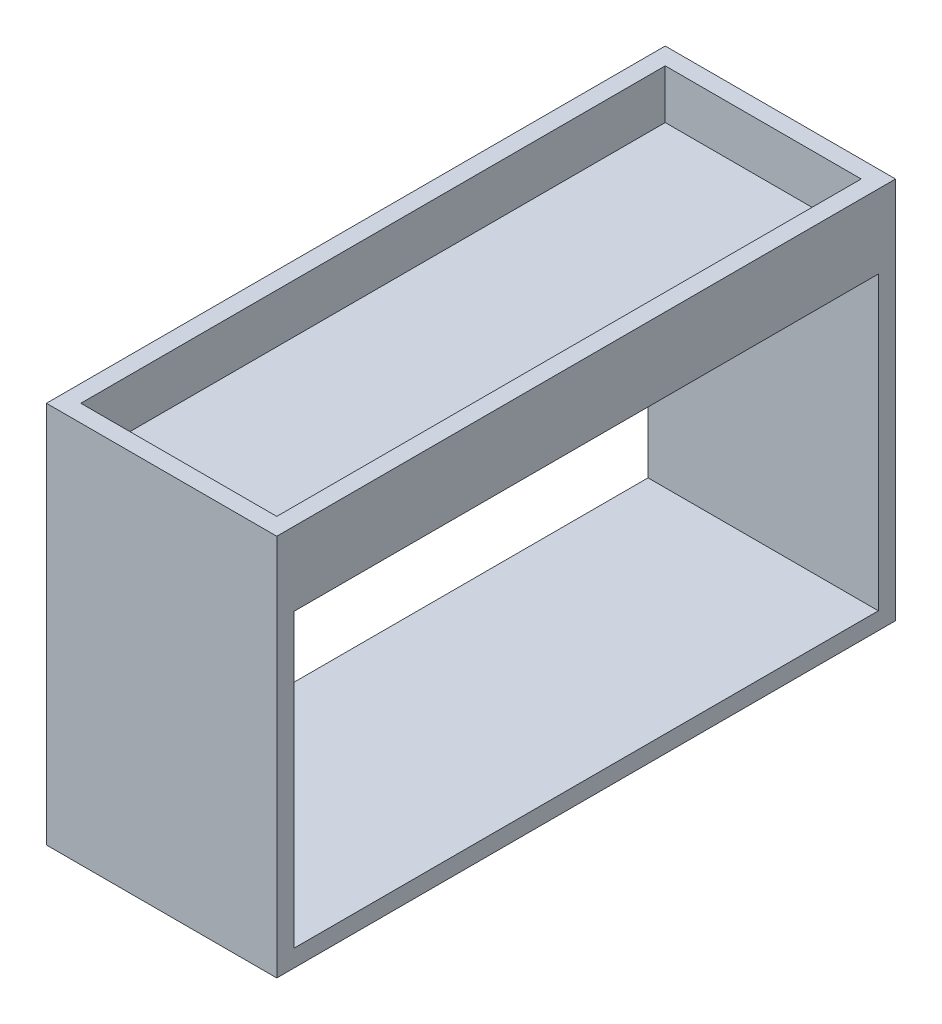
ISO-10303-21;
HEADER;
FILE_DESCRIPTION(('STEP AP214'),'2;1');
FILE_NAME('part.step','',(''),(''),'','','');
FILE_SCHEMA(('AUTOMOTIVE_DESIGN { 1 0 10303 214 1 1 1 1 }'));
ENDSEC;
DATA;
#1=APPLICATION_CONTEXT('core data for automotive mechanical design processes');
#2=APPLICATION_PROTOCOL_DEFINITION('international standard','automotive_design',2000,#1);
#3=PRODUCT_CONTEXT('',#1,'mechanical');
#4=PRODUCT('Part','Part','',(#3));
#5=PRODUCT_RELATED_PRODUCT_CATEGORY('part','',(#4));
#6=PRODUCT_DEFINITION_FORMATION('','',#4);
#7=PRODUCT_DEFINITION_CONTEXT('part definition',#1,'design');
#8=PRODUCT_DEFINITION('design','',#6,#7);
#9=PRODUCT_DEFINITION_SHAPE('','',#8);
#10=(LENGTH_UNIT() NAMED_UNIT(*) SI_UNIT(.MILLI.,.METRE.));
#11=(NAMED_UNIT(*) PLANE_ANGLE_UNIT() SI_UNIT($,.RADIAN.));
#12=(NAMED_UNIT(*) SI_UNIT($,.STERADIAN.) SOLID_ANGLE_UNIT());
#13=UNCERTAINTY_MEASURE_WITH_UNIT(LENGTH_MEASURE(1.E-05),#10,'distance_accuracy_value','');
#14=(GEOMETRIC_REPRESENTATION_CONTEXT(3) GLOBAL_UNCERTAINTY_ASSIGNED_CONTEXT((#13)) GLOBAL_UNIT_ASSIGNED_CONTEXT((#10,
#11,#12)) REPRESENTATION_CONTEXT('',''));
#15=CARTESIAN_POINT('',(0.,0.,0.));
#16=DIRECTION('',(0.,0.,1.));
#17=DIRECTION('',(1.,0.,0.));
#18=AXIS2_PLACEMENT_3D('',#15,#16,#17);
#19=CARTESIAN_POINT('',(-234.5,-779.,630.));
#20=DIRECTION('',(-1.,0.,0.));
#21=DIRECTION('',(0.,0.,1.));
#22=AXIS2_PLACEMENT_3D('',#19,#20,#21);
#23=PLANE('',#22);
#24=DIRECTION('',(0.,1.,0.));
#25=VECTOR('',#24,1.);
#26=CARTESIAN_POINT('',(-234.5,-744.,595.));
#27=LINE('',#26,#25);
#28=CARTESIAN_POINT('',(-234.5,-744.,595.));
#29=VERTEX_POINT('',#28);
#30=CARTESIAN_POINT('',(-234.5,-150.,595.));
#31=VERTEX_POINT('',#30);
#32=EDGE_CURVE('E49',#29,#31,#27,.T.);
#33=ORIENTED_EDGE('',*,*,#32,.F.);
#34=DIRECTION('',(0.,0.,1.));
#35=VECTOR('',#34,1.);
#36=CARTESIAN_POINT('',(-234.5,-744.,595.));
#37=LINE('',#36,#35);
#38=CARTESIAN_POINT('',(-234.5,-744.,-595.));
#39=VERTEX_POINT('',#38);
#40=EDGE_CURVE('E140',#39,#29,#37,.T.);
#41=ORIENTED_EDGE('',*,*,#40,.F.);
#42=DIRECTION('',(0.,-1.,0.));
#43=VECTOR('',#42,1.);
#44=CARTESIAN_POINT('',(-234.5,-744.,-595.));
#45=LINE('',#44,#43);
#46=CARTESIAN_POINT('',(-234.5,-150.,-595.));
#47=VERTEX_POINT('',#46);
#48=EDGE_CURVE('E143',#47,#39,#45,.T.);
#49=ORIENTED_EDGE('',*,*,#48,.F.);
#50=DIRECTION('',(0.,0.,-1.));
#51=VECTOR('',#50,1.);
#52=CARTESIAN_POINT('',(-234.5,-150.,595.));
#53=LINE('',#52,#51);
#54=EDGE_CURVE('E149',#31,#47,#53,.T.);
#55=ORIENTED_EDGE('',*,*,#54,.F.);
#56=EDGE_LOOP('',(#33,#41,#49,#55));
#57=FACE_BOUND('',#56,.T.);
#58=DIRECTION('',(0.,0.,1.));
#59=VECTOR('',#58,1.);
#60=CARTESIAN_POINT('',(-234.5,0.,630.));
#61=LINE('',#60,#59);
#62=CARTESIAN_POINT('',(-234.5,0.,-630.));
#63=VERTEX_POINT('',#62);
#64=CARTESIAN_POINT('',(-234.5,0.,630.));
#65=VERTEX_POINT('',#64);
#66=EDGE_CURVE('E184',#63,#65,#61,.T.);
#67=ORIENTED_EDGE('',*,*,#66,.F.);
#68=DIRECTION('',(0.,1.,0.));
#69=VECTOR('',#68,1.);
#70=CARTESIAN_POINT('',(-234.5,-779.,-630.));
#71=LINE('',#70,#69);
#72=CARTESIAN_POINT('',(-234.5,-779.,-630.));
#73=VERTEX_POINT('',#72);
#74=EDGE_CURVE('E11',#73,#63,#71,.T.);
#75=ORIENTED_EDGE('',*,*,#74,.F.);
#76=DIRECTION('',(0.,0.,1.));
#77=VECTOR('',#76,1.);
#78=CARTESIAN_POINT('',(-234.5,-779.,630.));
#79=LINE('',#78,#77);
#80=CARTESIAN_POINT('',(-234.5,-779.,630.));
#81=VERTEX_POINT('',#80);
#82=EDGE_CURVE('E191',#73,#81,#79,.T.);
#83=ORIENTED_EDGE('',*,*,#82,.T.);
#84=DIRECTION('',(0.,1.,0.));
#85=VECTOR('',#84,1.);
#86=CARTESIAN_POINT('',(-234.5,-779.,630.));
#87=LINE('',#86,#85);
#88=EDGE_CURVE('E36',#81,#65,#87,.T.);
#89=ORIENTED_EDGE('',*,*,#88,.T.);
#90=EDGE_LOOP('',(#67,#75,#83,#89));
#91=FACE_BOUND('',#90,.T.);
#92=ADVANCED_FACE('F33',(#57,#91),#23,.T.);
#93=CARTESIAN_POINT('',(234.5,-779.,-630.));
#94=DIRECTION('',(0.,0.,-1.));
#95=DIRECTION('',(-1.,0.,0.));
#96=AXIS2_PLACEMENT_3D('',#93,#94,#95);
#97=PLANE('',#96);
#98=DIRECTION('',(-1.,0.,0.));
#99=VECTOR('',#98,1.);
#100=CARTESIAN_POINT('',(234.5,0.,-630.));
#101=LINE('',#100,#99);
#102=CARTESIAN_POINT('',(234.5,0.,-630.));
#103=VERTEX_POINT('',#102);
#104=EDGE_CURVE('E195',#103,#63,#101,.T.);
#105=ORIENTED_EDGE('',*,*,#104,.F.);
#106=DIRECTION('',(0.,1.,0.));
#107=VECTOR('',#106,1.);
#108=CARTESIAN_POINT('',(234.5,-779.,-630.));
#109=LINE('',#108,#107);
#110=CARTESIAN_POINT('',(234.5,-779.,-630.));
#111=VERTEX_POINT('',#110);
#112=EDGE_CURVE('E41',#111,#103,#109,.T.);
#113=ORIENTED_EDGE('',*,*,#112,.F.);
#114=DIRECTION('',(-1.,0.,0.));
#115=VECTOR('',#114,1.);
#116=CARTESIAN_POINT('',(234.5,-779.,-630.));
#117=LINE('',#116,#115);
#118=EDGE_CURVE('E201',#111,#73,#117,.T.);
#119=ORIENTED_EDGE('',*,*,#118,.T.);
#120=ORIENTED_EDGE('',*,*,#74,.T.);
#121=EDGE_LOOP('',(#105,#113,#119,#120));
#122=FACE_BOUND('',#121,.T.);
#123=ADVANCED_FACE('F227',(#122),#97,.T.);
#124=CARTESIAN_POINT('',(234.5,-779.,630.));
#125=DIRECTION('',(1.,0.,0.));
#126=DIRECTION('',(0.,0.,-1.));
#127=AXIS2_PLACEMENT_3D('',#124,#125,#126);
#128=PLANE('',#127);
#129=DIRECTION('',(0.,1.,0.));
#130=VECTOR('',#129,1.);
#131=CARTESIAN_POINT('',(234.5,-744.,595.));
#132=LINE('',#131,#130);
#133=CARTESIAN_POINT('',(234.5,-744.,595.));
#134=VERTEX_POINT('',#133);
#135=CARTESIAN_POINT('',(234.5,-150.,595.));
#136=VERTEX_POINT('',#135);
#137=EDGE_CURVE('E124',#134,#136,#132,.T.);
#138=ORIENTED_EDGE('',*,*,#137,.T.);
#139=DIRECTION('',(0.,0.,-1.));
#140=VECTOR('',#139,1.);
#141=CARTESIAN_POINT('',(234.5,-150.,595.));
#142=LINE('',#141,#140);
#143=CARTESIAN_POINT('',(234.5,-150.,-595.));
#144=VERTEX_POINT('',#143);
#145=EDGE_CURVE('E133',#136,#144,#142,.T.);
#146=ORIENTED_EDGE('',*,*,#145,.T.);
#147=DIRECTION('',(0.,-1.,0.));
#148=VECTOR('',#147,1.);
#149=CARTESIAN_POINT('',(234.5,-744.,-595.));
#150=LINE('',#149,#148);
#151=CARTESIAN_POINT('',(234.5,-744.,-595.));
#152=VERTEX_POINT('',#151);
#153=EDGE_CURVE('E57',#144,#152,#150,.T.);
#154=ORIENTED_EDGE('',*,*,#153,.T.);
#155=DIRECTION('',(0.,0.,1.));
#156=VECTOR('',#155,1.);
#157=CARTESIAN_POINT('',(234.5,-744.,595.));
#158=LINE('',#157,#156);
#159=EDGE_CURVE('E130',#152,#134,#158,.T.);
#160=ORIENTED_EDGE('',*,*,#159,.T.);
#161=EDGE_LOOP('',(#138,#146,#154,#160));
#162=FACE_BOUND('',#161,.T.);
#163=DIRECTION('',(0.,0.,-1.));
#164=VECTOR('',#163,1.);
#165=CARTESIAN_POINT('',(234.5,0.,630.));
#166=LINE('',#165,#164);
#167=CARTESIAN_POINT('',(234.5,0.,630.));
#168=VERTEX_POINT('',#167);
#169=EDGE_CURVE('E209',#168,#103,#166,.T.);
#170=ORIENTED_EDGE('',*,*,#169,.F.);
#171=DIRECTION('',(0.,1.,0.));
#172=VECTOR('',#171,1.);
#173=CARTESIAN_POINT('',(234.5,-779.,630.));
#174=LINE('',#173,#172);
#175=CARTESIAN_POINT('',(234.5,-779.,630.));
#176=VERTEX_POINT('',#175);
#177=EDGE_CURVE('E214',#176,#168,#174,.T.);
#178=ORIENTED_EDGE('',*,*,#177,.F.);
#179=DIRECTION('',(0.,0.,-1.));
#180=VECTOR('',#179,1.);
#181=CARTESIAN_POINT('',(234.5,-779.,630.));
#182=LINE('',#181,#180);
#183=EDGE_CURVE('E198',#176,#111,#182,.T.);
#184=ORIENTED_EDGE('',*,*,#183,.T.);
#185=ORIENTED_EDGE('',*,*,#112,.T.);
#186=EDGE_LOOP('',(#170,#178,#184,#185));
#187=FACE_BOUND('',#186,.T.);
#188=ADVANCED_FACE('F137',(#162,#187),#128,.T.);
#189=CARTESIAN_POINT('',(234.5,-779.,630.));
#190=DIRECTION('',(0.,0.,1.));
#191=DIRECTION('',(1.,0.,0.));
#192=AXIS2_PLACEMENT_3D('',#189,#190,#191);
#193=PLANE('',#192);
#194=DIRECTION('',(1.,0.,0.));
#195=VECTOR('',#194,1.);
#196=CARTESIAN_POINT('',(234.5,0.,630.));
#197=LINE('',#196,#195);
#198=EDGE_CURVE('E206',#65,#168,#197,.T.);
#199=ORIENTED_EDGE('',*,*,#198,.F.);
#200=ORIENTED_EDGE('',*,*,#88,.F.);
#201=DIRECTION('',(1.,0.,0.));
#202=VECTOR('',#201,1.);
#203=CARTESIAN_POINT('',(234.5,-779.,630.));
#204=LINE('',#203,#202);
#205=EDGE_CURVE('E194',#81,#176,#204,.T.);
#206=ORIENTED_EDGE('',*,*,#205,.T.);
#207=ORIENTED_EDGE('',*,*,#177,.T.);
#208=EDGE_LOOP('',(#199,#200,#206,#207));
#209=FACE_BOUND('',#208,.T.);
#210=ADVANCED_FACE('F222',(#209),#193,.T.);
#211=CARTESIAN_POINT('',(0.,-779.,0.));
#212=DIRECTION('',(0.,1.,0.));
#213=DIRECTION('',(0.,0.,1.));
#214=AXIS2_PLACEMENT_3D('',#211,#212,#213);
#215=PLANE('',#214);
#216=ORIENTED_EDGE('',*,*,#82,.F.);
#217=ORIENTED_EDGE('',*,*,#118,.F.);
#218=ORIENTED_EDGE('',*,*,#183,.F.);
#219=ORIENTED_EDGE('',*,*,#205,.F.);
#220=EDGE_LOOP('',(#216,#217,#218,#219));
#221=FACE_BOUND('',#220,.T.);
#222=ADVANCED_FACE('F230',(#221),#215,.F.);
#223=CARTESIAN_POINT('',(0.,0.,0.));
#224=DIRECTION('',(0.,1.,0.));
#225=DIRECTION('',(0.,0.,1.));
#226=AXIS2_PLACEMENT_3D('',#223,#224,#225);
#227=PLANE('',#226);
#228=DIRECTION('',(0.,0.,1.));
#229=VECTOR('',#228,1.);
#230=CARTESIAN_POINT('',(-199.5,0.,595.));
#231=LINE('',#230,#229);
#232=CARTESIAN_POINT('',(-199.5,0.,-595.));
#233=VERTEX_POINT('',#232);
#234=CARTESIAN_POINT('',(-199.5,0.,595.));
#235=VERTEX_POINT('',#234);
#236=EDGE_CURVE('E155',#233,#235,#231,.T.);
#237=ORIENTED_EDGE('',*,*,#236,.F.);
#238=DIRECTION('',(-1.,0.,0.));
#239=VECTOR('',#238,1.);
#240=CARTESIAN_POINT('',(199.5,0.,-595.));
#241=LINE('',#240,#239);
#242=CARTESIAN_POINT('',(199.5,0.,-595.));
#243=VERTEX_POINT('',#242);
#244=EDGE_CURVE('E163',#243,#233,#241,.T.);
#245=ORIENTED_EDGE('',*,*,#244,.F.);
#246=DIRECTION('',(0.,0.,-1.));
#247=VECTOR('',#246,1.);
#248=CARTESIAN_POINT('',(199.5,0.,595.));
#249=LINE('',#248,#247);
#250=CARTESIAN_POINT('',(199.5,0.,595.));
#251=VERTEX_POINT('',#250);
#252=EDGE_CURVE('E177',#251,#243,#249,.T.);
#253=ORIENTED_EDGE('',*,*,#252,.F.);
#254=DIRECTION('',(1.,0.,0.));
#255=VECTOR('',#254,1.);
#256=CARTESIAN_POINT('',(199.5,0.,595.));
#257=LINE('',#256,#255);
#258=EDGE_CURVE('E174',#235,#251,#257,.T.);
#259=ORIENTED_EDGE('',*,*,#258,.F.);
#260=EDGE_LOOP('',(#237,#245,#253,#259));
#261=FACE_BOUND('',#260,.T.);
#262=ORIENTED_EDGE('',*,*,#66,.T.);
#263=ORIENTED_EDGE('',*,*,#198,.T.);
#264=ORIENTED_EDGE('',*,*,#169,.T.);
#265=ORIENTED_EDGE('',*,*,#104,.T.);
#266=EDGE_LOOP('',(#262,#263,#264,#265));
#267=FACE_BOUND('',#266,.T.);
#268=ADVANCED_FACE('F224',(#261,#267),#227,.T.);
#269=CARTESIAN_POINT('',(-199.5,-100.,595.));
#270=DIRECTION('',(-1.,0.,0.));
#271=DIRECTION('',(0.,0.,1.));
#272=AXIS2_PLACEMENT_3D('',#269,#270,#271);
#273=PLANE('',#272);
#274=ORIENTED_EDGE('',*,*,#236,.T.);
#275=DIRECTION('',(0.,1.,0.));
#276=VECTOR('',#275,1.);
#277=CARTESIAN_POINT('',(-199.5,-100.,595.));
#278=LINE('',#277,#276);
#279=CARTESIAN_POINT('',(-199.5,-100.,595.));
#280=VERTEX_POINT('',#279);
#281=EDGE_CURVE('E172',#280,#235,#278,.T.);
#282=ORIENTED_EDGE('',*,*,#281,.F.);
#283=DIRECTION('',(0.,0.,1.));
#284=VECTOR('',#283,1.);
#285=CARTESIAN_POINT('',(-199.5,-100.,595.));
#286=LINE('',#285,#284);
#287=CARTESIAN_POINT('',(-199.5,-100.,-595.));
#288=VERTEX_POINT('',#287);
#289=EDGE_CURVE('E159',#288,#280,#286,.T.);
#290=ORIENTED_EDGE('',*,*,#289,.F.);
#291=DIRECTION('',(0.,1.,0.));
#292=VECTOR('',#291,1.);
#293=CARTESIAN_POINT('',(-199.5,-100.,-595.));
#294=LINE('',#293,#292);
#295=EDGE_CURVE('E182',#288,#233,#294,.T.);
#296=ORIENTED_EDGE('',*,*,#295,.T.);
#297=EDGE_LOOP('',(#274,#282,#290,#296));
#298=FACE_BOUND('',#297,.T.);
#299=ADVANCED_FACE('F268',(#298),#273,.F.);
#300=CARTESIAN_POINT('',(199.5,-100.,-595.));
#301=DIRECTION('',(0.,0.,-1.));
#302=DIRECTION('',(-1.,0.,0.));
#303=AXIS2_PLACEMENT_3D('',#300,#301,#302);
#304=PLANE('',#303);
#305=ORIENTED_EDGE('',*,*,#244,.T.);
#306=ORIENTED_EDGE('',*,*,#295,.F.);
#307=DIRECTION('',(-1.,0.,0.));
#308=VECTOR('',#307,1.);
#309=CARTESIAN_POINT('',(199.5,-100.,-595.));
#310=LINE('',#309,#308);
#311=CARTESIAN_POINT('',(199.5,-100.,-595.));
#312=VERTEX_POINT('',#311);
#313=EDGE_CURVE('E169',#312,#288,#310,.T.);
#314=ORIENTED_EDGE('',*,*,#313,.F.);
#315=DIRECTION('',(0.,1.,0.));
#316=VECTOR('',#315,1.);
#317=CARTESIAN_POINT('',(199.5,-100.,-595.));
#318=LINE('',#317,#316);
#319=EDGE_CURVE('E185',#312,#243,#318,.T.);
#320=ORIENTED_EDGE('',*,*,#319,.T.);
#321=EDGE_LOOP('',(#305,#306,#314,#320));
#322=FACE_BOUND('',#321,.T.);
#323=ADVANCED_FACE('F264',(#322),#304,.F.);
#324=CARTESIAN_POINT('',(199.5,-100.,595.));
#325=DIRECTION('',(1.,0.,0.));
#326=DIRECTION('',(0.,0.,-1.));
#327=AXIS2_PLACEMENT_3D('',#324,#325,#326);
#328=PLANE('',#327);
#329=ORIENTED_EDGE('',*,*,#252,.T.);
#330=ORIENTED_EDGE('',*,*,#319,.F.);
#331=DIRECTION('',(0.,0.,-1.));
#332=VECTOR('',#331,1.);
#333=CARTESIAN_POINT('',(199.5,-100.,595.));
#334=LINE('',#333,#332);
#335=CARTESIAN_POINT('',(199.5,-100.,595.));
#336=VERTEX_POINT('',#335);
#337=EDGE_CURVE('E166',#336,#312,#334,.T.);
#338=ORIENTED_EDGE('',*,*,#337,.F.);
#339=DIRECTION('',(0.,1.,0.));
#340=VECTOR('',#339,1.);
#341=CARTESIAN_POINT('',(199.5,-100.,595.));
#342=LINE('',#341,#340);
#343=EDGE_CURVE('E187',#336,#251,#342,.T.);
#344=ORIENTED_EDGE('',*,*,#343,.T.);
#345=EDGE_LOOP('',(#329,#330,#338,#344));
#346=FACE_BOUND('',#345,.T.);
#347=ADVANCED_FACE('F267',(#346),#328,.F.);
#348=CARTESIAN_POINT('',(199.5,-100.,595.));
#349=DIRECTION('',(0.,0.,1.));
#350=DIRECTION('',(1.,0.,0.));
#351=AXIS2_PLACEMENT_3D('',#348,#349,#350);
#352=PLANE('',#351);
#353=ORIENTED_EDGE('',*,*,#258,.T.);
#354=ORIENTED_EDGE('',*,*,#343,.F.);
#355=DIRECTION('',(1.,0.,0.));
#356=VECTOR('',#355,1.);
#357=CARTESIAN_POINT('',(199.5,-100.,595.));
#358=LINE('',#357,#356);
#359=EDGE_CURVE('E162',#280,#336,#358,.T.);
#360=ORIENTED_EDGE('',*,*,#359,.F.);
#361=ORIENTED_EDGE('',*,*,#281,.T.);
#362=EDGE_LOOP('',(#353,#354,#360,#361));
#363=FACE_BOUND('',#362,.T.);
#364=ADVANCED_FACE('F262',(#363),#352,.F.);
#365=CARTESIAN_POINT('',(0.,-100.,0.));
#366=DIRECTION('',(0.,1.,0.));
#367=DIRECTION('',(0.,0.,1.));
#368=AXIS2_PLACEMENT_3D('',#365,#366,#367);
#369=PLANE('',#368);
#370=ORIENTED_EDGE('',*,*,#289,.T.);
#371=ORIENTED_EDGE('',*,*,#359,.T.);
#372=ORIENTED_EDGE('',*,*,#337,.T.);
#373=ORIENTED_EDGE('',*,*,#313,.T.);
#374=EDGE_LOOP('',(#370,#371,#372,#373));
#375=FACE_BOUND('',#374,.T.);
#376=ADVANCED_FACE('F255',(#375),#369,.T.);
#377=CARTESIAN_POINT('',(234.5,-744.,595.));
#378=DIRECTION('',(0.,0.,1.));
#379=DIRECTION('',(1.,0.,0.));
#380=AXIS2_PLACEMENT_3D('',#377,#378,#379);
#381=PLANE('',#380);
#382=ORIENTED_EDGE('',*,*,#32,.T.);
#383=DIRECTION('',(-1.,0.,0.));
#384=VECTOR('',#383,1.);
#385=CARTESIAN_POINT('',(234.5,-150.,595.));
#386=LINE('',#385,#384);
#387=EDGE_CURVE('E120',#136,#31,#386,.T.);
#388=ORIENTED_EDGE('',*,*,#387,.F.);
#389=ORIENTED_EDGE('',*,*,#137,.F.);
#390=DIRECTION('',(-1.,0.,0.));
#391=VECTOR('',#390,1.);
#392=CARTESIAN_POINT('',(234.5,-744.,595.));
#393=LINE('',#392,#391);
#394=EDGE_CURVE('E153',#134,#29,#393,.T.);
#395=ORIENTED_EDGE('',*,*,#394,.T.);
#396=EDGE_LOOP('',(#382,#388,#389,#395));
#397=FACE_BOUND('',#396,.T.);
#398=ADVANCED_FACE('F122',(#397),#381,.F.);
#399=CARTESIAN_POINT('',(234.5,-744.,595.));
#400=DIRECTION('',(0.,-1.,0.));
#401=DIRECTION('',(0.,0.,-1.));
#402=AXIS2_PLACEMENT_3D('',#399,#400,#401);
#403=PLANE('',#402);
#404=ORIENTED_EDGE('',*,*,#40,.T.);
#405=ORIENTED_EDGE('',*,*,#394,.F.);
#406=ORIENTED_EDGE('',*,*,#159,.F.);
#407=DIRECTION('',(-1.,0.,0.));
#408=VECTOR('',#407,1.);
#409=CARTESIAN_POINT('',(234.5,-744.,-595.));
#410=LINE('',#409,#408);
#411=EDGE_CURVE('E156',#152,#39,#410,.T.);
#412=ORIENTED_EDGE('',*,*,#411,.T.);
#413=EDGE_LOOP('',(#404,#405,#406,#412));
#414=FACE_BOUND('',#413,.T.);
#415=ADVANCED_FACE('F247',(#414),#403,.F.);
#416=CARTESIAN_POINT('',(234.5,-744.,-595.));
#417=DIRECTION('',(0.,0.,-1.));
#418=DIRECTION('',(-1.,0.,0.));
#419=AXIS2_PLACEMENT_3D('',#416,#417,#418);
#420=PLANE('',#419);
#421=ORIENTED_EDGE('',*,*,#48,.T.);
#422=ORIENTED_EDGE('',*,*,#411,.F.);
#423=ORIENTED_EDGE('',*,*,#153,.F.);
#424=DIRECTION('',(-1.,0.,0.));
#425=VECTOR('',#424,1.);
#426=CARTESIAN_POINT('',(234.5,-150.,-595.));
#427=LINE('',#426,#425);
#428=EDGE_CURVE('E129',#144,#47,#427,.T.);
#429=ORIENTED_EDGE('',*,*,#428,.T.);
#430=EDGE_LOOP('',(#421,#422,#423,#429));
#431=FACE_BOUND('',#430,.T.);
#432=ADVANCED_FACE('F245',(#431),#420,.F.);
#433=CARTESIAN_POINT('',(234.5,-150.,595.));
#434=DIRECTION('',(0.,1.,0.));
#435=DIRECTION('',(0.,0.,1.));
#436=AXIS2_PLACEMENT_3D('',#433,#434,#435);
#437=PLANE('',#436);
#438=ORIENTED_EDGE('',*,*,#54,.T.);
#439=ORIENTED_EDGE('',*,*,#428,.F.);
#440=ORIENTED_EDGE('',*,*,#145,.F.);
#441=ORIENTED_EDGE('',*,*,#387,.T.);
#442=EDGE_LOOP('',(#438,#439,#440,#441));
#443=FACE_BOUND('',#442,.T.);
#444=ADVANCED_FACE('F134',(#443),#437,.F.);
#445=CLOSED_SHELL('',(#92,#123,#188,#210,#222,#268,#299,#323,#347,#364,#376,#398,#415,#432,#444));
#446=MANIFOLD_SOLID_BREP('B2',#445);
#447=ADVANCED_BREP_SHAPE_REPRESENTATION('',(#18,#446),#14);
#448=SHAPE_DEFINITION_REPRESENTATION(#9,#447);
ENDSEC;
END-ISO-10303-21;
